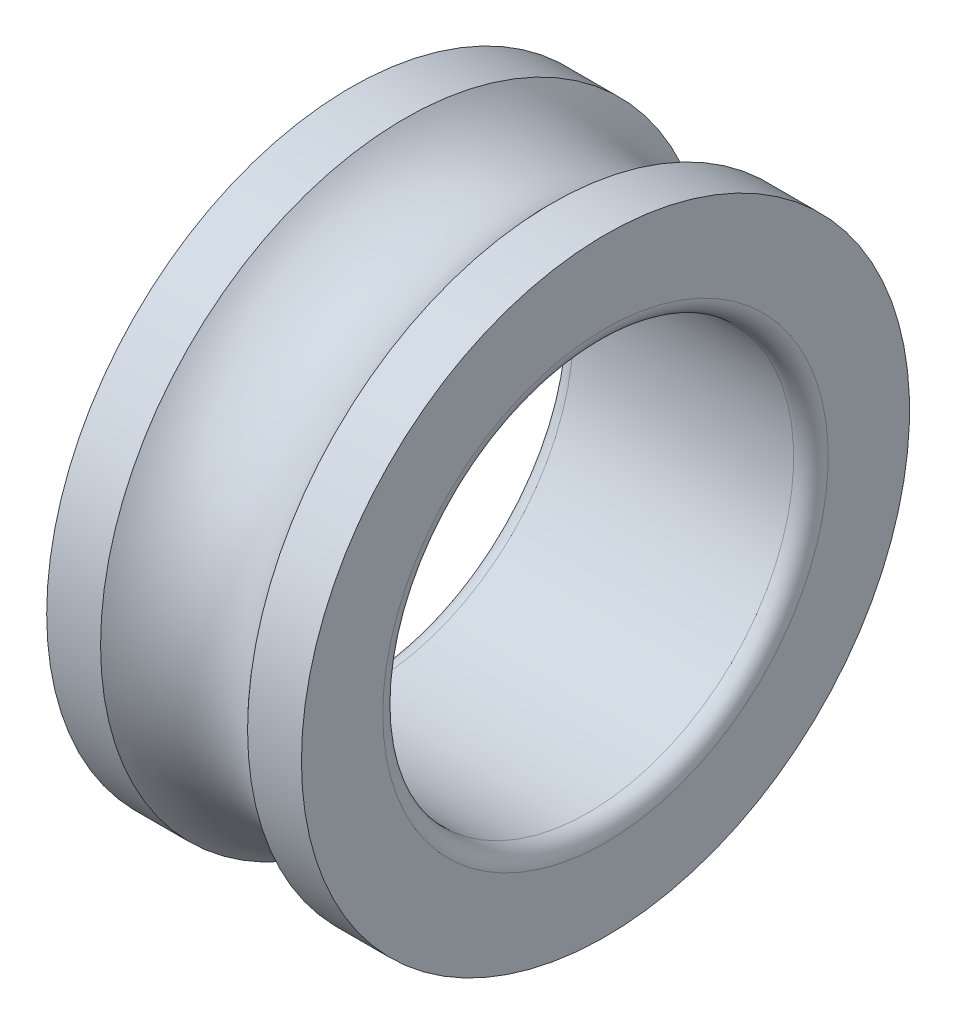
ISO-10303-21;
HEADER;
FILE_DESCRIPTION(('STEP AP214'),'2;1');
FILE_NAME('part.step','',(''),(''),'','','');
FILE_SCHEMA(('AUTOMOTIVE_DESIGN { 1 0 10303 214 1 1 1 1 }'));
ENDSEC;
DATA;
#1=APPLICATION_CONTEXT('core data for automotive mechanical design processes');
#2=APPLICATION_PROTOCOL_DEFINITION('international standard','automotive_design',2000,#1);
#3=PRODUCT_CONTEXT('',#1,'mechanical');
#4=PRODUCT('Part','Part','',(#3));
#5=PRODUCT_RELATED_PRODUCT_CATEGORY('part','',(#4));
#6=PRODUCT_DEFINITION_FORMATION('','',#4);
#7=PRODUCT_DEFINITION_CONTEXT('part definition',#1,'design');
#8=PRODUCT_DEFINITION('design','',#6,#7);
#9=PRODUCT_DEFINITION_SHAPE('','',#8);
#10=(LENGTH_UNIT() NAMED_UNIT(*) SI_UNIT(.MILLI.,.METRE.));
#11=(NAMED_UNIT(*) PLANE_ANGLE_UNIT() SI_UNIT($,.RADIAN.));
#12=(NAMED_UNIT(*) SI_UNIT($,.STERADIAN.) SOLID_ANGLE_UNIT());
#13=UNCERTAINTY_MEASURE_WITH_UNIT(LENGTH_MEASURE(1.E-05),#10,'distance_accuracy_value','');
#14=(GEOMETRIC_REPRESENTATION_CONTEXT(3) GLOBAL_UNCERTAINTY_ASSIGNED_CONTEXT((#13)) GLOBAL_UNIT_ASSIGNED_CONTEXT((#10,
#11,#12)) REPRESENTATION_CONTEXT('',''));
#15=CARTESIAN_POINT('',(0.,0.,0.));
#16=DIRECTION('',(0.,0.,1.));
#17=DIRECTION('',(1.,0.,0.));
#18=AXIS2_PLACEMENT_3D('',#15,#16,#17);
#19=CARTESIAN_POINT('',(-15.5,37.,0.));
#20=DIRECTION('',(1.,0.,0.));
#21=DIRECTION('',(0.,0.,-1.));
#22=AXIS2_PLACEMENT_3D('',#19,#20,#21);
#23=PLANE('',#22);
#24=CARTESIAN_POINT('',(-15.5,0.,0.));
#25=DIRECTION('',(-1.,0.,0.));
#26=DIRECTION('',(0.,0.,1.));
#27=AXIS2_PLACEMENT_3D('',#24,#25,#26);
#28=CIRCLE('',#27,27.1);
#29=CARTESIAN_POINT('',(-15.5,0.,27.1));
#30=VERTEX_POINT('',#29);
#31=EDGE_CURVE('E10',#30,#30,#28,.T.);
#32=ORIENTED_EDGE('',*,*,#31,.F.);
#33=EDGE_LOOP('',(#32));
#34=FACE_BOUND('',#33,.T.);
#35=CARTESIAN_POINT('',(-15.5,0.,0.));
#36=DIRECTION('',(-1.,0.,0.));
#37=DIRECTION('',(0.,0.,1.));
#38=AXIS2_PLACEMENT_3D('',#35,#36,#37);
#39=CIRCLE('',#38,37.);
#40=CARTESIAN_POINT('',(-15.5,0.,37.));
#41=VERTEX_POINT('',#40);
#42=EDGE_CURVE('E74',#41,#41,#39,.T.);
#43=ORIENTED_EDGE('',*,*,#42,.T.);
#44=EDGE_LOOP('',(#43));
#45=FACE_BOUND('',#44,.T.);
#46=ADVANCED_FACE('F39',(#34,#45),#23,.F.);
#47=CARTESIAN_POINT('',(-13.4,0.,0.));
#48=DIRECTION('',(-1.,0.,0.));
#49=DIRECTION('',(0.,0.,1.));
#50=AXIS2_PLACEMENT_3D('',#47,#48,#49);
#51=TOROIDAL_SURFACE('',#50,27.1,2.1);
#52=CARTESIAN_POINT('',(-13.4,0.,0.));
#53=DIRECTION('',(-1.,0.,0.));
#54=DIRECTION('',(0.,0.,1.));
#55=AXIS2_PLACEMENT_3D('',#52,#53,#54);
#56=CIRCLE('',#55,25.);
#57=CARTESIAN_POINT('',(-13.4,0.,25.));
#58=VERTEX_POINT('',#57);
#59=EDGE_CURVE('E46',#58,#58,#56,.T.);
#60=ORIENTED_EDGE('',*,*,#59,.F.);
#61=EDGE_LOOP('',(#60));
#62=FACE_BOUND('',#61,.T.);
#63=ORIENTED_EDGE('',*,*,#31,.T.);
#64=EDGE_LOOP('',(#63));
#65=FACE_BOUND('',#64,.T.);
#66=ADVANCED_FACE('F112',(#62,#65),#51,.T.);
#67=CARTESIAN_POINT('',(0.,0.,0.));
#68=DIRECTION('',(-1.,0.,0.));
#69=DIRECTION('',(0.,0.,1.));
#70=AXIS2_PLACEMENT_3D('',#67,#68,#69);
#71=CYLINDRICAL_SURFACE('',#70,25.);
#72=CARTESIAN_POINT('',(13.4,0.,0.));
#73=DIRECTION('',(-1.,0.,0.));
#74=DIRECTION('',(0.,0.,1.));
#75=AXIS2_PLACEMENT_3D('',#72,#73,#74);
#76=CIRCLE('',#75,25.);
#77=CARTESIAN_POINT('',(13.4,0.,25.));
#78=VERTEX_POINT('',#77);
#79=EDGE_CURVE('E51',#78,#78,#76,.T.);
#80=ORIENTED_EDGE('',*,*,#79,.F.);
#81=EDGE_LOOP('',(#80));
#82=FACE_BOUND('',#81,.T.);
#83=ORIENTED_EDGE('',*,*,#59,.T.);
#84=EDGE_LOOP('',(#83));
#85=FACE_BOUND('',#84,.T.);
#86=ADVANCED_FACE('F107',(#82,#85),#71,.F.);
#87=CARTESIAN_POINT('',(13.4,0.,0.));
#88=DIRECTION('',(-1.,0.,0.));
#89=DIRECTION('',(0.,0.,1.));
#90=AXIS2_PLACEMENT_3D('',#87,#88,#89);
#91=TOROIDAL_SURFACE('',#90,27.1,2.1);
#92=CARTESIAN_POINT('',(15.5,0.,0.));
#93=DIRECTION('',(-1.,0.,0.));
#94=DIRECTION('',(0.,0.,1.));
#95=AXIS2_PLACEMENT_3D('',#92,#93,#94);
#96=CIRCLE('',#95,27.1);
#97=CARTESIAN_POINT('',(15.5,0.,27.1));
#98=VERTEX_POINT('',#97);
#99=EDGE_CURVE('E56',#98,#98,#96,.T.);
#100=ORIENTED_EDGE('',*,*,#99,.F.);
#101=EDGE_LOOP('',(#100));
#102=FACE_BOUND('',#101,.T.);
#103=ORIENTED_EDGE('',*,*,#79,.T.);
#104=EDGE_LOOP('',(#103));
#105=FACE_BOUND('',#104,.T.);
#106=ADVANCED_FACE('F101',(#102,#105),#91,.T.);
#107=CARTESIAN_POINT('',(15.5,37.,0.));
#108=DIRECTION('',(-1.,0.,0.));
#109=DIRECTION('',(0.,0.,1.));
#110=AXIS2_PLACEMENT_3D('',#107,#108,#109);
#111=PLANE('',#110);
#112=CARTESIAN_POINT('',(15.5,0.,0.));
#113=DIRECTION('',(-1.,0.,0.));
#114=DIRECTION('',(0.,0.,1.));
#115=AXIS2_PLACEMENT_3D('',#112,#113,#114);
#116=CIRCLE('',#115,37.);
#117=CARTESIAN_POINT('',(15.5,0.,37.));
#118=VERTEX_POINT('',#117);
#119=EDGE_CURVE('E62',#118,#118,#116,.T.);
#120=ORIENTED_EDGE('',*,*,#119,.F.);
#121=EDGE_LOOP('',(#120));
#122=FACE_BOUND('',#121,.T.);
#123=ORIENTED_EDGE('',*,*,#99,.T.);
#124=EDGE_LOOP('',(#123));
#125=FACE_BOUND('',#124,.T.);
#126=ADVANCED_FACE('F95',(#122,#125),#111,.F.);
#127=CARTESIAN_POINT('',(0.,0.,0.));
#128=DIRECTION('',(-1.,0.,0.));
#129=DIRECTION('',(0.,0.,1.));
#130=AXIS2_PLACEMENT_3D('',#127,#128,#129);
#131=CYLINDRICAL_SURFACE('',#130,37.);
#132=CARTESIAN_POINT('',(8.94427190999916,0.,0.));
#133=DIRECTION('',(-1.,0.,0.));
#134=DIRECTION('',(0.,0.,1.));
#135=AXIS2_PLACEMENT_3D('',#132,#133,#134);
#136=CIRCLE('',#135,37.);
#137=CARTESIAN_POINT('',(8.94427190999916,0.,37.));
#138=VERTEX_POINT('',#137);
#139=EDGE_CURVE('E66',#138,#138,#136,.T.);
#140=ORIENTED_EDGE('',*,*,#139,.F.);
#141=EDGE_LOOP('',(#140));
#142=FACE_BOUND('',#141,.T.);
#143=ORIENTED_EDGE('',*,*,#119,.T.);
#144=EDGE_LOOP('',(#143));
#145=FACE_BOUND('',#144,.T.);
#146=ADVANCED_FACE('F89',(#142,#145),#131,.T.);
#147=CARTESIAN_POINT('',(0.,0.,0.));
#148=DIRECTION('',(-1.,0.,0.));
#149=DIRECTION('',(0.,0.,1.));
#150=AXIS2_PLACEMENT_3D('',#147,#148,#149);
#151=TOROIDAL_SURFACE('',#150,45.,12.);
#152=CARTESIAN_POINT('',(-8.94427190999916,0.,0.));
#153=DIRECTION('',(-1.,0.,0.));
#154=DIRECTION('',(0.,0.,1.));
#155=AXIS2_PLACEMENT_3D('',#152,#153,#154);
#156=CIRCLE('',#155,37.);
#157=CARTESIAN_POINT('',(-8.94427190999916,0.,37.));
#158=VERTEX_POINT('',#157);
#159=EDGE_CURVE('E70',#158,#158,#156,.T.);
#160=ORIENTED_EDGE('',*,*,#159,.F.);
#161=EDGE_LOOP('',(#160));
#162=FACE_BOUND('',#161,.T.);
#163=ORIENTED_EDGE('',*,*,#139,.T.);
#164=EDGE_LOOP('',(#163));
#165=FACE_BOUND('',#164,.T.);
#166=ADVANCED_FACE('F83',(#162,#165),#151,.F.);
#167=CARTESIAN_POINT('',(0.,0.,0.));
#168=DIRECTION('',(-1.,0.,0.));
#169=DIRECTION('',(0.,0.,1.));
#170=AXIS2_PLACEMENT_3D('',#167,#168,#169);
#171=CYLINDRICAL_SURFACE('',#170,37.);
#172=ORIENTED_EDGE('',*,*,#42,.F.);
#173=EDGE_LOOP('',(#172));
#174=FACE_BOUND('',#173,.T.);
#175=ORIENTED_EDGE('',*,*,#159,.T.);
#176=EDGE_LOOP('',(#175));
#177=FACE_BOUND('',#176,.T.);
#178=ADVANCED_FACE('F80',(#174,#177),#171,.T.);
#179=CLOSED_SHELL('',(#46,#66,#86,#106,#126,#146,#166,#178));
#180=MANIFOLD_SOLID_BREP('B2',#179);
#181=ADVANCED_BREP_SHAPE_REPRESENTATION('',(#18,#180),#14);
#182=SHAPE_DEFINITION_REPRESENTATION(#9,#181);
ENDSEC;
END-ISO-10303-21;
